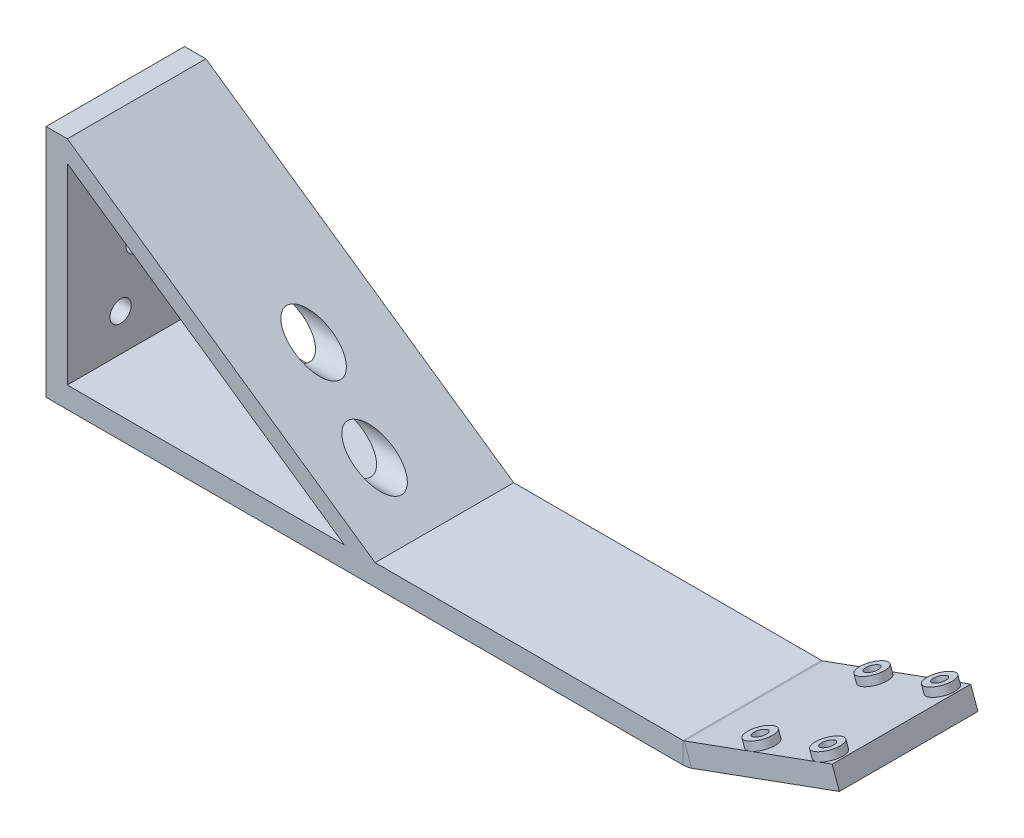
ISO-10303-21;
HEADER;
FILE_DESCRIPTION(('STEP AP214'),'2;1');
FILE_NAME('part.step','',(''),(''),'','','');
FILE_SCHEMA(('AUTOMOTIVE_DESIGN { 1 0 10303 214 1 1 1 1 }'));
ENDSEC;
DATA;
#1=APPLICATION_CONTEXT('core data for automotive mechanical design processes');
#2=APPLICATION_PROTOCOL_DEFINITION('international standard','automotive_design',2000,#1);
#3=PRODUCT_CONTEXT('',#1,'mechanical');
#4=PRODUCT('Part','Part','',(#3));
#5=PRODUCT_RELATED_PRODUCT_CATEGORY('part','',(#4));
#6=PRODUCT_DEFINITION_FORMATION('','',#4);
#7=PRODUCT_DEFINITION_CONTEXT('part definition',#1,'design');
#8=PRODUCT_DEFINITION('design','',#6,#7);
#9=PRODUCT_DEFINITION_SHAPE('','',#8);
#10=(LENGTH_UNIT() NAMED_UNIT(*) SI_UNIT(.MILLI.,.METRE.));
#11=(NAMED_UNIT(*) PLANE_ANGLE_UNIT() SI_UNIT($,.RADIAN.));
#12=(NAMED_UNIT(*) SI_UNIT($,.STERADIAN.) SOLID_ANGLE_UNIT());
#13=UNCERTAINTY_MEASURE_WITH_UNIT(LENGTH_MEASURE(1.E-05),#10,'distance_accuracy_value','');
#14=(GEOMETRIC_REPRESENTATION_CONTEXT(3) GLOBAL_UNCERTAINTY_ASSIGNED_CONTEXT((#13)) GLOBAL_UNIT_ASSIGNED_CONTEXT((#10,
#11,#12)) REPRESENTATION_CONTEXT('',''));
#15=CARTESIAN_POINT('',(0.,0.,0.));
#16=DIRECTION('',(0.,0.,1.));
#17=DIRECTION('',(1.,0.,0.));
#18=AXIS2_PLACEMENT_3D('',#15,#16,#17);
#19=CARTESIAN_POINT('',(0.,0.,0.));
#20=DIRECTION('',(0.,1.,0.));
#21=DIRECTION('',(0.,0.,1.));
#22=AXIS2_PLACEMENT_3D('',#19,#20,#21);
#23=PLANE('',#22);
#24=DIRECTION('',(1.,0.,0.));
#25=VECTOR('',#24,1.);
#26=CARTESIAN_POINT('',(-75.,0.,13.));
#27=LINE('',#26,#25);
#28=CARTESIAN_POINT('',(-71.,0.,13.));
#29=VERTEX_POINT('',#28);
#30=CARTESIAN_POINT('',(-19.0149320613954,0.,13.));
#31=VERTEX_POINT('',#30);
#32=EDGE_CURVE('E69',#29,#31,#27,.T.);
#33=ORIENTED_EDGE('',*,*,#32,.T.);
#34=DIRECTION('',(0.,0.,-1.));
#35=VECTOR('',#34,1.);
#36=CARTESIAN_POINT('',(-19.0149320613954,0.,0.));
#37=LINE('',#36,#35);
#38=CARTESIAN_POINT('',(-19.0149320613954,0.,-13.));
#39=VERTEX_POINT('',#38);
#40=EDGE_CURVE('E208',#31,#39,#37,.T.);
#41=ORIENTED_EDGE('',*,*,#40,.T.);
#42=DIRECTION('',(-1.,0.,0.));
#43=VECTOR('',#42,1.);
#44=CARTESIAN_POINT('',(-75.,0.,-13.));
#45=LINE('',#44,#43);
#46=CARTESIAN_POINT('',(-71.,0.,-13.));
#47=VERTEX_POINT('',#46);
#48=EDGE_CURVE('E248',#39,#47,#45,.T.);
#49=ORIENTED_EDGE('',*,*,#48,.T.);
#50=DIRECTION('',(0.,0.,-1.));
#51=VECTOR('',#50,1.);
#52=CARTESIAN_POINT('',(-71.,0.,13.));
#53=LINE('',#52,#51);
#54=EDGE_CURVE('E181',#29,#47,#53,.T.);
#55=ORIENTED_EDGE('',*,*,#54,.F.);
#56=EDGE_LOOP('',(#33,#41,#49,#55));
#57=FACE_BOUND('',#56,.T.);
#58=ADVANCED_FACE('F44',(#57),#23,.T.);
#59=CARTESIAN_POINT('',(-71.,40.,13.));
#60=DIRECTION('',(-1.,0.,0.));
#61=DIRECTION('',(0.,0.,1.));
#62=AXIS2_PLACEMENT_3D('',#59,#60,#61);
#63=PLANE('',#62);
#64=CARTESIAN_POINT('',(-71.,7.,3.00000000000004));
#65=DIRECTION('',(1.,0.,0.));
#66=DIRECTION('',(0.,0.,-1.));
#67=AXIS2_PLACEMENT_3D('',#64,#65,#66);
#68=CIRCLE('',#67,2.);
#69=CARTESIAN_POINT('',(-71.,7.,1.00000000000004));
#70=VERTEX_POINT('',#69);
#71=EDGE_CURVE('E190',#70,#70,#68,.T.);
#72=ORIENTED_EDGE('',*,*,#71,.F.);
#73=EDGE_LOOP('',(#72));
#74=FACE_BOUND('',#73,.T.);
#75=CARTESIAN_POINT('',(-71.,17.,0.));
#76=DIRECTION('',(1.,0.,0.));
#77=DIRECTION('',(0.,0.,-1.));
#78=AXIS2_PLACEMENT_3D('',#75,#76,#77);
#79=CIRCLE('',#78,2.);
#80=CARTESIAN_POINT('',(-71.,17.,-1.99999999999996));
#81=VERTEX_POINT('',#80);
#82=EDGE_CURVE('E196',#81,#81,#79,.T.);
#83=ORIENTED_EDGE('',*,*,#82,.F.);
#84=EDGE_LOOP('',(#83));
#85=FACE_BOUND('',#84,.T.);
#86=DIRECTION('',(0.,0.,-1.));
#87=VECTOR('',#86,1.);
#88=CARTESIAN_POINT('',(-71.,36.,-13.));
#89=LINE('',#88,#87);
#90=CARTESIAN_POINT('',(-71.,36.,13.));
#91=VERTEX_POINT('',#90);
#92=CARTESIAN_POINT('',(-71.,36.,-13.));
#93=VERTEX_POINT('',#92);
#94=EDGE_CURVE('E194',#91,#93,#89,.T.);
#95=ORIENTED_EDGE('',*,*,#94,.F.);
#96=DIRECTION('',(0.,-1.,0.));
#97=VECTOR('',#96,1.);
#98=CARTESIAN_POINT('',(-71.,40.,13.));
#99=LINE('',#98,#97);
#100=EDGE_CURVE('E239',#91,#29,#99,.T.);
#101=ORIENTED_EDGE('',*,*,#100,.T.);
#102=ORIENTED_EDGE('',*,*,#54,.T.);
#103=DIRECTION('',(0.,-1.,0.));
#104=VECTOR('',#103,1.);
#105=CARTESIAN_POINT('',(-71.,40.,-13.));
#106=LINE('',#105,#104);
#107=EDGE_CURVE('E235',#93,#47,#106,.T.);
#108=ORIENTED_EDGE('',*,*,#107,.F.);
#109=EDGE_LOOP('',(#95,#101,#102,#108));
#110=FACE_BOUND('',#109,.T.);
#111=ADVANCED_FACE('F419',(#74,#85,#110),#63,.F.);
#112=DIRECTION('',(0.,0.,1.));
#113=VECTOR('',#112,1.);
#114=CARTESIAN_POINT('',(-13.2388134015504,0.,-13.));
#115=LINE('',#114,#113);
#116=CARTESIAN_POINT('',(-13.2388134015504,0.,-13.));
#117=VERTEX_POINT('',#116);
#118=CARTESIAN_POINT('',(-13.2388134015504,0.,13.));
#119=VERTEX_POINT('',#118);
#120=EDGE_CURVE('E61',#117,#119,#115,.T.);
#121=ORIENTED_EDGE('',*,*,#120,.T.);
#122=CARTESIAN_POINT('',(44.5223731968992,0.,13.));
#123=VERTEX_POINT('',#122);
#124=EDGE_CURVE('E174',#119,#123,#27,.T.);
#125=ORIENTED_EDGE('',*,*,#124,.T.);
#126=DIRECTION('',(0.,0.,-1.));
#127=VECTOR('',#126,1.);
#128=CARTESIAN_POINT('',(44.5223731968992,0.,0.));
#129=LINE('',#128,#127);
#130=CARTESIAN_POINT('',(44.5223731968992,0.,-13.));
#131=VERTEX_POINT('',#130);
#132=EDGE_CURVE('E254',#123,#131,#129,.T.);
#133=ORIENTED_EDGE('',*,*,#132,.T.);
#134=EDGE_CURVE('E244',#131,#117,#45,.T.);
#135=ORIENTED_EDGE('',*,*,#134,.T.);
#136=EDGE_LOOP('',(#121,#125,#133,#135));
#137=FACE_BOUND('',#136,.T.);
#138=ADVANCED_FACE('F421',(#137),#23,.T.);
#139=CARTESIAN_POINT('',(3.40739549004638,-19.2686125049224,0.));
#140=DIRECTION('',(-0.342020143325669,0.939692620785908,0.));
#141=DIRECTION('',(0.,0.,1.));
#142=AXIS2_PLACEMENT_3D('',#139,#140,#141);
#143=PLANE('',#142);
#144=CARTESIAN_POINT('',(71.0652641866318,5.35683781452583,-10.5));
#145=DIRECTION('',(-0.342020143325669,0.939692620785908,0.));
#146=DIRECTION('',(-0.939692620785908,-0.342020143325669,0.));
#147=AXIS2_PLACEMENT_3D('',#144,#145,#146);
#148=CIRCLE('',#147,1.25);
#149=CARTESIAN_POINT('',(69.8906484106494,4.92931263536875,-10.5));
#150=VERTEX_POINT('',#149);
#151=EDGE_CURVE('E375',#150,#150,#148,.T.);
#152=ORIENTED_EDGE('',*,*,#151,.T.);
#153=EDGE_LOOP('',(#152));
#154=FACE_BOUND('',#153,.T.);
#155=CARTESIAN_POINT('',(58.379413806022,0.739565879629296,10.5));
#156=DIRECTION('',(-0.342020143325669,0.939692620785908,0.));
#157=DIRECTION('',(-0.939692620785908,-0.342020143325669,0.));
#158=AXIS2_PLACEMENT_3D('',#155,#156,#157);
#159=CIRCLE('',#158,1.25);
#160=CARTESIAN_POINT('',(57.2047980300396,0.312040700472209,10.5));
#161=VERTEX_POINT('',#160);
#162=EDGE_CURVE('E381',#161,#161,#159,.F.);
#163=ORIENTED_EDGE('',*,*,#162,.F.);
#164=EDGE_LOOP('',(#163));
#165=FACE_BOUND('',#164,.T.);
#166=CARTESIAN_POINT('',(58.379413806022,0.739565879629296,-10.5));
#167=DIRECTION('',(-0.342020143325669,0.939692620785908,0.));
#168=DIRECTION('',(-0.939692620785908,-0.342020143325669,0.));
#169=AXIS2_PLACEMENT_3D('',#166,#167,#168);
#170=CIRCLE('',#169,1.25);
#171=CARTESIAN_POINT('',(57.2047980300396,0.312040700472209,-10.5));
#172=VERTEX_POINT('',#171);
#173=EDGE_CURVE('E370',#172,#172,#170,.T.);
#174=ORIENTED_EDGE('',*,*,#173,.T.);
#175=EDGE_LOOP('',(#174));
#176=FACE_BOUND('',#175,.T.);
#177=CARTESIAN_POINT('',(71.0652641866318,5.35683781452583,10.5));
#178=DIRECTION('',(-0.342020143325669,0.939692620785908,0.));
#179=DIRECTION('',(-0.939692620785908,-0.342020143325669,0.));
#180=AXIS2_PLACEMENT_3D('',#177,#178,#179);
#181=CIRCLE('',#180,1.25);
#182=CARTESIAN_POINT('',(69.8906484106494,4.92931263536875,10.5));
#183=VERTEX_POINT('',#182);
#184=EDGE_CURVE('E366',#183,#183,#181,.F.);
#185=ORIENTED_EDGE('',*,*,#184,.F.);
#186=EDGE_LOOP('',(#185));
#187=FACE_BOUND('',#186,.T.);
#188=DIRECTION('',(0.939692620785908,0.342020143325669,0.));
#189=VECTOR('',#188,1.);
#190=CARTESIAN_POINT('',(-67.0695510688967,-44.9201232543476,13.));
#191=LINE('',#190,#189);
#192=CARTESIAN_POINT('',(46.1423858077756,-3.71434806761453,13.));
#193=VERTEX_POINT('',#192);
#194=CARTESIAN_POINT('',(73.8843420489895,6.38289824450285,13.));
#195=VERTEX_POINT('',#194);
#196=EDGE_CURVE('E240',#193,#195,#191,.T.);
#197=ORIENTED_EDGE('',*,*,#196,.F.);
#198=DIRECTION('',(0.,0.,-1.));
#199=VECTOR('',#198,1.);
#200=CARTESIAN_POINT('',(46.1423858077756,-3.71434806761453,0.));
#201=LINE('',#200,#199);
#202=CARTESIAN_POINT('',(46.1423858077756,-3.71434806761454,-13.));
#203=VERTEX_POINT('',#202);
#204=EDGE_CURVE('E295',#193,#203,#201,.T.);
#205=ORIENTED_EDGE('',*,*,#204,.T.);
#206=DIRECTION('',(-0.939692620785908,-0.342020143325669,0.));
#207=VECTOR('',#206,1.);
#208=CARTESIAN_POINT('',(-67.0695510688967,-44.9201232543476,-13.));
#209=LINE('',#208,#207);
#210=CARTESIAN_POINT('',(73.8843420489895,6.38289824450285,-13.));
#211=VERTEX_POINT('',#210);
#212=EDGE_CURVE('E287',#211,#203,#209,.T.);
#213=ORIENTED_EDGE('',*,*,#212,.F.);
#214=DIRECTION('',(0.,0.,-1.));
#215=VECTOR('',#214,1.);
#216=CARTESIAN_POINT('',(73.8843420489895,6.38289824450285,-13.));
#217=LINE('',#216,#215);
#218=EDGE_CURVE('E284',#195,#211,#217,.T.);
#219=ORIENTED_EDGE('',*,*,#218,.F.);
#220=EDGE_LOOP('',(#197,#205,#213,#219));
#221=FACE_BOUND('',#220,.T.);
#222=ADVANCED_FACE('F389',(#154,#165,#176,#187,#221),#143,.F.);
#223=CARTESIAN_POINT('',(-67.0695510688967,-44.9201232543476,-13.));
#224=DIRECTION('',(0.,0.,-1.));
#225=DIRECTION('',(-0.939692620785908,-0.342020143325669,0.));
#226=AXIS2_PLACEMENT_3D('',#223,#224,#225);
#227=PLANE('',#226);
#228=DIRECTION('',(0.342020143325669,-0.939692620785908,0.));
#229=VECTOR('',#228,1.);
#230=CARTESIAN_POINT('',(46.1423858077756,-3.71434806761453,-13.));
#231=LINE('',#230,#229);
#232=CARTESIAN_POINT('',(44.7743052344729,0.0444224155290995,-13.));
#233=VERTEX_POINT('',#232);
#234=EDGE_CURVE('E13',#233,#203,#231,.T.);
#235=ORIENTED_EDGE('',*,*,#234,.F.);
#236=DIRECTION('',(-0.939692620785908,-0.342020143325669,0.));
#237=VECTOR('',#236,1.);
#238=CARTESIAN_POINT('',(-68.4376316421994,-41.1613527712039,-13.));
#239=LINE('',#238,#237);
#240=CARTESIAN_POINT('',(57.0113332327193,4.49833636277293,-13.));
#241=VERTEX_POINT('',#240);
#242=EDGE_CURVE('E291',#241,#233,#239,.T.);
#243=ORIENTED_EDGE('',*,*,#242,.F.);
#244=CARTESIAN_POINT('',(69.6971836133291,9.11560829766946,-13.));
#245=VERTEX_POINT('',#244);
#246=EDGE_CURVE('E309',#245,#241,#239,.T.);
#247=ORIENTED_EDGE('',*,*,#246,.F.);
#248=CARTESIAN_POINT('',(72.5162614756868,10.1416687276465,-13.));
#249=VERTEX_POINT('',#248);
#250=EDGE_CURVE('E307',#249,#245,#239,.T.);
#251=ORIENTED_EDGE('',*,*,#250,.F.);
#252=DIRECTION('',(-0.342020143325669,0.939692620785908,0.));
#253=VECTOR('',#252,1.);
#254=CARTESIAN_POINT('',(73.8843420489895,6.38289824450285,-13.));
#255=LINE('',#254,#253);
#256=EDGE_CURVE('E293',#211,#249,#255,.T.);
#257=ORIENTED_EDGE('',*,*,#256,.F.);
#258=ORIENTED_EDGE('',*,*,#212,.T.);
#259=EDGE_LOOP('',(#235,#243,#247,#251,#257,#258));
#260=FACE_BOUND('',#259,.T.);
#261=ADVANCED_FACE('F46',(#260),#227,.T.);
#262=CARTESIAN_POINT('',(73.8843420489895,6.38289824450285,-13.));
#263=DIRECTION('',(0.939692620785908,0.342020143325669,0.));
#264=DIRECTION('',(0.,0.,-1.));
#265=AXIS2_PLACEMENT_3D('',#262,#263,#264);
#266=PLANE('',#265);
#267=DIRECTION('',(0.,0.,-1.));
#268=VECTOR('',#267,1.);
#269=CARTESIAN_POINT('',(72.5162614756868,10.1416687276465,-13.));
#270=LINE('',#269,#268);
#271=CARTESIAN_POINT('',(72.5162614756868,10.1416687276465,13.));
#272=VERTEX_POINT('',#271);
#273=EDGE_CURVE('E288',#272,#249,#270,.T.);
#274=ORIENTED_EDGE('',*,*,#273,.F.);
#275=DIRECTION('',(-0.342020143325669,0.939692620785908,0.));
#276=VECTOR('',#275,1.);
#277=CARTESIAN_POINT('',(73.8843420489895,6.38289824450285,13.));
#278=LINE('',#277,#276);
#279=EDGE_CURVE('E296',#195,#272,#278,.T.);
#280=ORIENTED_EDGE('',*,*,#279,.F.);
#281=ORIENTED_EDGE('',*,*,#218,.T.);
#282=ORIENTED_EDGE('',*,*,#256,.T.);
#283=EDGE_LOOP('',(#274,#280,#281,#282));
#284=FACE_BOUND('',#283,.T.);
#285=ADVANCED_FACE('F438',(#284),#266,.T.);
#286=CARTESIAN_POINT('',(-67.0695510688967,-44.9201232543476,13.));
#287=DIRECTION('',(0.,0.,1.));
#288=DIRECTION('',(0.939692620785908,0.342020143325669,0.));
#289=AXIS2_PLACEMENT_3D('',#286,#287,#288);
#290=PLANE('',#289);
#291=DIRECTION('',(-0.342020143325669,0.939692620785908,0.));
#292=VECTOR('',#291,1.);
#293=CARTESIAN_POINT('',(46.1423858077756,-3.71434806761453,13.));
#294=LINE('',#293,#292);
#295=CARTESIAN_POINT('',(44.7743052344729,0.0444224155290995,13.));
#296=VERTEX_POINT('',#295);
#297=EDGE_CURVE('E301',#193,#296,#294,.T.);
#298=ORIENTED_EDGE('',*,*,#297,.F.);
#299=ORIENTED_EDGE('',*,*,#196,.T.);
#300=ORIENTED_EDGE('',*,*,#279,.T.);
#301=DIRECTION('',(0.939692620785908,0.342020143325669,0.));
#302=VECTOR('',#301,1.);
#303=CARTESIAN_POINT('',(-68.4376316421994,-41.1613527712039,13.));
#304=LINE('',#303,#302);
#305=CARTESIAN_POINT('',(69.6971836133291,9.11560829766946,13.));
#306=VERTEX_POINT('',#305);
#307=EDGE_CURVE('E312',#306,#272,#304,.T.);
#308=ORIENTED_EDGE('',*,*,#307,.F.);
#309=CARTESIAN_POINT('',(57.0113332327193,4.49833636277293,13.));
#310=VERTEX_POINT('',#309);
#311=EDGE_CURVE('E311',#310,#306,#304,.T.);
#312=ORIENTED_EDGE('',*,*,#311,.F.);
#313=EDGE_CURVE('E292',#296,#310,#304,.T.);
#314=ORIENTED_EDGE('',*,*,#313,.F.);
#315=EDGE_LOOP('',(#298,#299,#300,#308,#312,#314));
#316=FACE_BOUND('',#315,.T.);
#317=ADVANCED_FACE('F443',(#316),#290,.T.);
#318=CARTESIAN_POINT('',(2.0393149167437,-15.5098420217787,0.));
#319=DIRECTION('',(-0.342020143325669,0.939692620785908,0.));
#320=DIRECTION('',(0.,0.,1.));
#321=AXIS2_PLACEMENT_3D('',#318,#319,#320);
#322=PLANE('',#321);
#323=ORIENTED_EDGE('',*,*,#313,.T.);
#324=CARTESIAN_POINT('',(57.0113332327193,4.49833636277293,10.5));
#325=DIRECTION('',(-0.342020143325669,0.939692620785908,0.));
#326=DIRECTION('',(0.939692620785908,0.342020143325669,0.));
#327=AXIS2_PLACEMENT_3D('',#324,#325,#326);
#328=CIRCLE('',#327,2.5);
#329=EDGE_CURVE('E359',#310,#310,#328,.T.);
#330=ORIENTED_EDGE('',*,*,#329,.F.);
#331=ORIENTED_EDGE('',*,*,#311,.T.);
#332=CARTESIAN_POINT('',(69.6971836133291,9.11560829766946,10.5));
#333=DIRECTION('',(-0.342020143325669,0.939692620785908,0.));
#334=DIRECTION('',(0.939692620785908,0.342020143325669,0.));
#335=AXIS2_PLACEMENT_3D('',#332,#333,#334);
#336=CIRCLE('',#335,2.5);
#337=EDGE_CURVE('E342',#306,#306,#336,.T.);
#338=ORIENTED_EDGE('',*,*,#337,.F.);
#339=ORIENTED_EDGE('',*,*,#307,.T.);
#340=ORIENTED_EDGE('',*,*,#273,.T.);
#341=ORIENTED_EDGE('',*,*,#250,.T.);
#342=CARTESIAN_POINT('',(69.6971836133291,9.11560829766946,-10.5));
#343=DIRECTION('',(-0.342020143325669,0.939692620785908,0.));
#344=DIRECTION('',(-0.939692620785908,-0.342020143325669,0.));
#345=AXIS2_PLACEMENT_3D('',#342,#343,#344);
#346=CIRCLE('',#345,2.5);
#347=EDGE_CURVE('E334',#245,#245,#346,.T.);
#348=ORIENTED_EDGE('',*,*,#347,.F.);
#349=ORIENTED_EDGE('',*,*,#246,.T.);
#350=CARTESIAN_POINT('',(57.0113332327193,4.49833636277293,-10.5));
#351=DIRECTION('',(-0.342020143325669,0.939692620785908,0.));
#352=DIRECTION('',(-0.939692620785908,-0.342020143325669,0.));
#353=AXIS2_PLACEMENT_3D('',#350,#351,#352);
#354=CIRCLE('',#353,2.5);
#355=EDGE_CURVE('E351',#241,#241,#354,.T.);
#356=ORIENTED_EDGE('',*,*,#355,.F.);
#357=ORIENTED_EDGE('',*,*,#242,.T.);
#358=DIRECTION('',(0.,0.,-1.));
#359=VECTOR('',#358,1.);
#360=CARTESIAN_POINT('',(44.7743052344729,0.044422415529103,0.));
#361=LINE('',#360,#359);
#362=EDGE_CURVE('E53',#296,#233,#361,.T.);
#363=ORIENTED_EDGE('',*,*,#362,.F.);
#364=EDGE_LOOP('',(#323,#330,#331,#338,#339,#340,#341,#348,#349,#356,#357,#363));
#365=FACE_BOUND('',#364,.T.);
#366=ADVANCED_FACE('F445',(#365),#322,.T.);
#367=CARTESIAN_POINT('',(-75.,-4.,-13.));
#368=DIRECTION('',(-1.,0.,0.));
#369=DIRECTION('',(0.,0.,1.));
#370=AXIS2_PLACEMENT_3D('',#367,#368,#369);
#371=PLANE('',#370);
#372=CARTESIAN_POINT('',(-75.,7.,3.00000000000004));
#373=DIRECTION('',(-1.,0.,0.));
#374=DIRECTION('',(0.,0.,1.));
#375=AXIS2_PLACEMENT_3D('',#372,#373,#374);
#376=CIRCLE('',#375,2.);
#377=CARTESIAN_POINT('',(-75.,7.,5.00000000000004));
#378=VERTEX_POINT('',#377);
#379=EDGE_CURVE('E48',#378,#378,#376,.T.);
#380=ORIENTED_EDGE('',*,*,#379,.F.);
#381=EDGE_LOOP('',(#380));
#382=FACE_BOUND('',#381,.T.);
#383=CARTESIAN_POINT('',(-75.,17.,0.));
#384=DIRECTION('',(-1.,0.,0.));
#385=DIRECTION('',(0.,0.,1.));
#386=AXIS2_PLACEMENT_3D('',#383,#384,#385);
#387=CIRCLE('',#386,2.);
#388=CARTESIAN_POINT('',(-75.,17.,2.00000000000004));
#389=VERTEX_POINT('',#388);
#390=EDGE_CURVE('E188',#389,#389,#387,.T.);
#391=ORIENTED_EDGE('',*,*,#390,.F.);
#392=EDGE_LOOP('',(#391));
#393=FACE_BOUND('',#392,.T.);
#394=DIRECTION('',(0.,1.,0.));
#395=VECTOR('',#394,1.);
#396=CARTESIAN_POINT('',(-75.,-4.,13.));
#397=LINE('',#396,#395);
#398=CARTESIAN_POINT('',(-75.,-4.,13.));
#399=VERTEX_POINT('',#398);
#400=CARTESIAN_POINT('',(-75.,40.,13.));
#401=VERTEX_POINT('',#400);
#402=EDGE_CURVE('E274',#399,#401,#397,.T.);
#403=ORIENTED_EDGE('',*,*,#402,.T.);
#404=DIRECTION('',(0.,0.,1.));
#405=VECTOR('',#404,1.);
#406=CARTESIAN_POINT('',(-75.,40.,13.));
#407=LINE('',#406,#405);
#408=CARTESIAN_POINT('',(-75.,40.,-13.));
#409=VERTEX_POINT('',#408);
#410=EDGE_CURVE('E179',#409,#401,#407,.T.);
#411=ORIENTED_EDGE('',*,*,#410,.F.);
#412=DIRECTION('',(0.,1.,0.));
#413=VECTOR('',#412,1.);
#414=CARTESIAN_POINT('',(-75.,-4.,-13.));
#415=LINE('',#414,#413);
#416=CARTESIAN_POINT('',(-75.,-4.,-13.));
#417=VERTEX_POINT('',#416);
#418=EDGE_CURVE('E272',#417,#409,#415,.T.);
#419=ORIENTED_EDGE('',*,*,#418,.F.);
#420=DIRECTION('',(0.,0.,1.));
#421=VECTOR('',#420,1.);
#422=CARTESIAN_POINT('',(-75.,-4.,-13.));
#423=LINE('',#422,#421);
#424=EDGE_CURVE('E275',#417,#399,#423,.T.);
#425=ORIENTED_EDGE('',*,*,#424,.T.);
#426=EDGE_LOOP('',(#403,#411,#419,#425));
#427=FACE_BOUND('',#426,.T.);
#428=ADVANCED_FACE('F270',(#382,#393,#427),#371,.T.);
#429=CARTESIAN_POINT('',(0.,-4.,0.));
#430=DIRECTION('',(0.,1.,0.));
#431=DIRECTION('',(0.,0.,1.));
#432=AXIS2_PLACEMENT_3D('',#429,#430,#431);
#433=PLANE('',#432);
#434=DIRECTION('',(0.,0.,-1.));
#435=VECTOR('',#434,1.);
#436=CARTESIAN_POINT('',(44.5223731968992,-4.,0.));
#437=LINE('',#436,#435);
#438=CARTESIAN_POINT('',(44.5223731968992,-4.,13.));
#439=VERTEX_POINT('',#438);
#440=CARTESIAN_POINT('',(44.5223731968992,-4.,-13.));
#441=VERTEX_POINT('',#440);
#442=EDGE_CURVE('E278',#439,#441,#437,.T.);
#443=ORIENTED_EDGE('',*,*,#442,.F.);
#444=DIRECTION('',(1.,0.,0.));
#445=VECTOR('',#444,1.);
#446=CARTESIAN_POINT('',(-75.,-4.,13.));
#447=LINE('',#446,#445);
#448=EDGE_CURVE('E264',#399,#439,#447,.T.);
#449=ORIENTED_EDGE('',*,*,#448,.F.);
#450=ORIENTED_EDGE('',*,*,#424,.F.);
#451=DIRECTION('',(-1.,0.,0.));
#452=VECTOR('',#451,1.);
#453=CARTESIAN_POINT('',(-75.,-4.,-13.));
#454=LINE('',#453,#452);
#455=EDGE_CURVE('E318',#441,#417,#454,.T.);
#456=ORIENTED_EDGE('',*,*,#455,.F.);
#457=EDGE_LOOP('',(#443,#449,#450,#456));
#458=FACE_BOUND('',#457,.T.);
#459=ADVANCED_FACE('F451',(#458),#433,.F.);
#460=CARTESIAN_POINT('',(-75.,-4.,13.));
#461=DIRECTION('',(0.,0.,1.));
#462=DIRECTION('',(1.,0.,0.));
#463=AXIS2_PLACEMENT_3D('',#460,#461,#462);
#464=PLANE('',#463);
#465=ORIENTED_EDGE('',*,*,#124,.F.);
#466=DIRECTION('',(-0.822115674060011,0.569320488358581,0.));
#467=VECTOR('',#466,1.);
#468=CARTESIAN_POINT('',(-71.,40.,13.));
#469=LINE('',#468,#467);
#470=CARTESIAN_POINT('',(-71.,40.,13.));
#471=VERTEX_POINT('',#470);
#472=EDGE_CURVE('E158',#119,#471,#469,.T.);
#473=ORIENTED_EDGE('',*,*,#472,.T.);
#474=DIRECTION('',(1.,0.,0.));
#475=VECTOR('',#474,1.);
#476=CARTESIAN_POINT('',(-75.,40.,13.));
#477=LINE('',#476,#475);
#478=EDGE_CURVE('E166',#401,#471,#477,.T.);
#479=ORIENTED_EDGE('',*,*,#478,.F.);
#480=ORIENTED_EDGE('',*,*,#402,.F.);
#481=ORIENTED_EDGE('',*,*,#448,.T.);
#482=DIRECTION('',(0.,1.,0.));
#483=VECTOR('',#482,1.);
#484=CARTESIAN_POINT('',(44.5223731968992,-4.,13.));
#485=LINE('',#484,#483);
#486=EDGE_CURVE('E260',#439,#123,#485,.T.);
#487=ORIENTED_EDGE('',*,*,#486,.T.);
#488=EDGE_LOOP('',(#465,#473,#479,#480,#481,#487));
#489=FACE_BOUND('',#488,.T.);
#490=DIRECTION('',(-0.822115674060011,0.569320488358581,0.));
#491=VECTOR('',#490,1.);
#492=CARTESIAN_POINT('',(-71.,36.,13.));
#493=LINE('',#492,#491);
#494=EDGE_CURVE('E175',#31,#91,#493,.T.);
#495=ORIENTED_EDGE('',*,*,#494,.F.);
#496=ORIENTED_EDGE('',*,*,#32,.F.);
#497=ORIENTED_EDGE('',*,*,#100,.F.);
#498=EDGE_LOOP('',(#495,#496,#497));
#499=FACE_BOUND('',#498,.T.);
#500=ADVANCED_FACE('F170',(#489,#499),#464,.T.);
#501=CARTESIAN_POINT('',(-75.,-4.,-13.));
#502=DIRECTION('',(0.,0.,-1.));
#503=DIRECTION('',(-1.,0.,0.));
#504=AXIS2_PLACEMENT_3D('',#501,#502,#503);
#505=PLANE('',#504);
#506=ORIENTED_EDGE('',*,*,#48,.F.);
#507=DIRECTION('',(0.822115674060011,-0.569320488358581,0.));
#508=VECTOR('',#507,1.);
#509=CARTESIAN_POINT('',(-71.,36.,-13.));
#510=LINE('',#509,#508);
#511=EDGE_CURVE('E209',#93,#39,#510,.T.);
#512=ORIENTED_EDGE('',*,*,#511,.F.);
#513=ORIENTED_EDGE('',*,*,#107,.T.);
#514=EDGE_LOOP('',(#506,#512,#513));
#515=FACE_BOUND('',#514,.T.);
#516=ORIENTED_EDGE('',*,*,#455,.T.);
#517=ORIENTED_EDGE('',*,*,#418,.T.);
#518=DIRECTION('',(-1.,0.,0.));
#519=VECTOR('',#518,1.);
#520=CARTESIAN_POINT('',(-75.,40.,-13.));
#521=LINE('',#520,#519);
#522=CARTESIAN_POINT('',(-71.,40.,-13.));
#523=VERTEX_POINT('',#522);
#524=EDGE_CURVE('E165',#523,#409,#521,.T.);
#525=ORIENTED_EDGE('',*,*,#524,.F.);
#526=DIRECTION('',(0.822115674060011,-0.569320488358581,0.));
#527=VECTOR('',#526,1.);
#528=CARTESIAN_POINT('',(-71.,40.,-13.));
#529=LINE('',#528,#527);
#530=EDGE_CURVE('E160',#523,#117,#529,.T.);
#531=ORIENTED_EDGE('',*,*,#530,.T.);
#532=ORIENTED_EDGE('',*,*,#134,.F.);
#533=DIRECTION('',(0.,-1.,0.));
#534=VECTOR('',#533,1.);
#535=CARTESIAN_POINT('',(44.5223731968992,-4.,-13.));
#536=LINE('',#535,#534);
#537=EDGE_CURVE('E247',#131,#441,#536,.T.);
#538=ORIENTED_EDGE('',*,*,#537,.T.);
#539=EDGE_LOOP('',(#516,#517,#525,#531,#532,#538));
#540=FACE_BOUND('',#539,.T.);
#541=ADVANCED_FACE('F465',(#515,#540),#505,.T.);
#542=CARTESIAN_POINT('',(44.5223731968992,0.7366,13.));
#543=DIRECTION('',(0.,0.,1.));
#544=DIRECTION('',(1.,0.,0.));
#545=AXIS2_PLACEMENT_3D('',#542,#543,#544);
#546=PLANE('',#545);
#547=ORIENTED_EDGE('',*,*,#297,.T.);
#548=CARTESIAN_POINT('',(44.5223731968992,0.7366,13.));
#549=DIRECTION('',(0.,0.,1.));
#550=DIRECTION('',(1.,0.,0.));
#551=AXIS2_PLACEMENT_3D('',#548,#549,#550);
#552=CIRCLE('',#551,0.7366);
#553=EDGE_CURVE('E321',#296,#123,#552,.F.);
#554=ORIENTED_EDGE('',*,*,#553,.T.);
#555=ORIENTED_EDGE('',*,*,#486,.F.);
#556=CARTESIAN_POINT('',(44.5223731968992,0.7366,13.));
#557=DIRECTION('',(0.,0.,-1.));
#558=DIRECTION('',(1.,0.,0.));
#559=AXIS2_PLACEMENT_3D('',#556,#557,#558);
#560=CIRCLE('',#559,4.7366);
#561=EDGE_CURVE('E329',#193,#439,#560,.T.);
#562=ORIENTED_EDGE('',*,*,#561,.F.);
#563=EDGE_LOOP('',(#547,#554,#555,#562));
#564=FACE_BOUND('',#563,.T.);
#565=ADVANCED_FACE('F462',(#564),#546,.T.);
#566=CARTESIAN_POINT('',(44.5223731968992,0.7366,-13.));
#567=DIRECTION('',(0.,0.,-1.));
#568=DIRECTION('',(-1.,0.,0.));
#569=AXIS2_PLACEMENT_3D('',#566,#567,#568);
#570=PLANE('',#569);
#571=ORIENTED_EDGE('',*,*,#537,.F.);
#572=CARTESIAN_POINT('',(44.5223731968992,0.7366,-13.));
#573=DIRECTION('',(0.,0.,1.));
#574=DIRECTION('',(1.,0.,0.));
#575=AXIS2_PLACEMENT_3D('',#572,#573,#574);
#576=CIRCLE('',#575,0.7366);
#577=EDGE_CURVE('E325',#131,#233,#576,.T.);
#578=ORIENTED_EDGE('',*,*,#577,.T.);
#579=ORIENTED_EDGE('',*,*,#234,.T.);
#580=CARTESIAN_POINT('',(44.5223731968992,0.7366,-13.));
#581=DIRECTION('',(0.,0.,1.));
#582=DIRECTION('',(-1.,0.,0.));
#583=AXIS2_PLACEMENT_3D('',#580,#581,#582);
#584=CIRCLE('',#583,4.7366);
#585=EDGE_CURVE('E283',#441,#203,#584,.T.);
#586=ORIENTED_EDGE('',*,*,#585,.F.);
#587=EDGE_LOOP('',(#571,#578,#579,#586));
#588=FACE_BOUND('',#587,.T.);
#589=ADVANCED_FACE('F473',(#588),#570,.T.);
#590=CARTESIAN_POINT('',(44.5223731968992,0.7366,-26.3232313641802));
#591=DIRECTION('',(0.,0.,1.));
#592=DIRECTION('',(1.,0.,0.));
#593=AXIS2_PLACEMENT_3D('',#590,#591,#592);
#594=CYLINDRICAL_SURFACE('',#593,4.7366);
#595=ORIENTED_EDGE('',*,*,#585,.T.);
#596=ORIENTED_EDGE('',*,*,#204,.F.);
#597=ORIENTED_EDGE('',*,*,#561,.T.);
#598=ORIENTED_EDGE('',*,*,#442,.T.);
#599=EDGE_LOOP('',(#595,#596,#597,#598));
#600=FACE_BOUND('',#599,.T.);
#601=ADVANCED_FACE('F486',(#600),#594,.T.);
#602=CARTESIAN_POINT('',(44.5223731968992,0.7366,-26.3232313641802));
#603=DIRECTION('',(0.,0.,1.));
#604=DIRECTION('',(1.,0.,0.));
#605=AXIS2_PLACEMENT_3D('',#602,#603,#604);
#606=CYLINDRICAL_SURFACE('',#605,0.7366);
#607=ORIENTED_EDGE('',*,*,#577,.F.);
#608=ORIENTED_EDGE('',*,*,#132,.F.);
#609=ORIENTED_EDGE('',*,*,#553,.F.);
#610=ORIENTED_EDGE('',*,*,#362,.T.);
#611=EDGE_LOOP('',(#607,#608,#609,#610));
#612=FACE_BOUND('',#611,.T.);
#613=ADVANCED_FACE('F504',(#612),#606,.F.);
#614=CARTESIAN_POINT('',(69.1841533983406,10.5251472288483,-10.5));
#615=DIRECTION('',(-0.342020143325669,0.939692620785908,0.));
#616=DIRECTION('',(-0.939692620785908,-0.342020143325669,0.));
#617=AXIS2_PLACEMENT_3D('',#614,#615,#616);
#618=PLANE('',#617);
#619=CARTESIAN_POINT('',(69.1841533983406,10.5251472288483,-10.5));
#620=DIRECTION('',(-0.342020143325669,0.939692620785908,0.));
#621=DIRECTION('',(-0.939692620785908,-0.342020143325669,0.));
#622=AXIS2_PLACEMENT_3D('',#619,#620,#621);
#623=CIRCLE('',#622,2.5);
#624=CARTESIAN_POINT('',(66.8349218463758,9.67009687053415,-10.5));
#625=VERTEX_POINT('',#624);
#626=EDGE_CURVE('E326',#625,#625,#623,.T.);
#627=ORIENTED_EDGE('',*,*,#626,.T.);
#628=EDGE_LOOP('',(#627));
#629=FACE_BOUND('',#628,.T.);
#630=CARTESIAN_POINT('',(69.1841533983406,10.5251472288483,-10.5));
#631=DIRECTION('',(-0.342020143325669,0.939692620785908,0.));
#632=DIRECTION('',(-0.939692620785908,-0.342020143325669,0.));
#633=AXIS2_PLACEMENT_3D('',#630,#631,#632);
#634=CIRCLE('',#633,1.25);
#635=CARTESIAN_POINT('',(68.0095376223582,10.0976220496912,-10.5));
#636=VERTEX_POINT('',#635);
#637=EDGE_CURVE('E336',#636,#636,#634,.T.);
#638=ORIENTED_EDGE('',*,*,#637,.F.);
#639=EDGE_LOOP('',(#638));
#640=FACE_BOUND('',#639,.T.);
#641=ADVANCED_FACE('F511',(#629,#640),#618,.T.);
#642=CARTESIAN_POINT('',(69.1841533983406,10.5251472288483,-10.5));
#643=DIRECTION('',(0.342020143325669,-0.939692620785908,0.));
#644=DIRECTION('',(0.939692620785908,0.342020143325669,0.));
#645=AXIS2_PLACEMENT_3D('',#642,#643,#644);
#646=CYLINDRICAL_SURFACE('',#645,2.5);
#647=ORIENTED_EDGE('',*,*,#626,.F.);
#648=EDGE_LOOP('',(#647));
#649=FACE_BOUND('',#648,.T.);
#650=ORIENTED_EDGE('',*,*,#347,.T.);
#651=EDGE_LOOP('',(#650));
#652=FACE_BOUND('',#651,.T.);
#653=ADVANCED_FACE('F508',(#649,#652),#646,.T.);
#654=CARTESIAN_POINT('',(69.1841533983406,10.5251472288483,-10.5));
#655=DIRECTION('',(0.342020143325669,-0.939692620785908,0.));
#656=DIRECTION('',(0.939692620785908,0.342020143325669,0.));
#657=AXIS2_PLACEMENT_3D('',#654,#655,#656);
#658=CYLINDRICAL_SURFACE('',#657,1.25);
#659=ORIENTED_EDGE('',*,*,#637,.T.);
#660=EDGE_LOOP('',(#659));
#661=FACE_BOUND('',#660,.T.);
#662=CARTESIAN_POINT('',(69.6971836133291,9.11560829766946,-10.5));
#663=DIRECTION('',(-0.342020143325669,0.939692620785908,0.));
#664=DIRECTION('',(-0.939692620785908,-0.342020143325669,0.));
#665=AXIS2_PLACEMENT_3D('',#662,#663,#664);
#666=CIRCLE('',#665,1.25);
#667=CARTESIAN_POINT('',(68.5225678373467,8.68808311851238,-10.5));
#668=VERTEX_POINT('',#667);
#669=EDGE_CURVE('E243',#668,#668,#666,.T.);
#670=ORIENTED_EDGE('',*,*,#669,.F.);
#671=EDGE_LOOP('',(#670));
#672=FACE_BOUND('',#671,.T.);
#673=ADVANCED_FACE('F510',(#661,#672),#658,.F.);
#674=CARTESIAN_POINT('',(69.1841533983406,10.5251472288483,10.5));
#675=DIRECTION('',(0.342020143325669,-0.939692620785908,0.));
#676=DIRECTION('',(0.939692620785908,0.342020143325669,0.));
#677=AXIS2_PLACEMENT_3D('',#674,#675,#676);
#678=PLANE('',#677);
#679=CARTESIAN_POINT('',(69.1841533983406,10.5251472288483,10.5));
#680=DIRECTION('',(-0.342020143325669,0.939692620785908,0.));
#681=DIRECTION('',(0.939692620785908,0.342020143325669,0.));
#682=AXIS2_PLACEMENT_3D('',#679,#680,#681);
#683=CIRCLE('',#682,2.5);
#684=CARTESIAN_POINT('',(71.5333849503053,11.3801975871625,10.5));
#685=VERTEX_POINT('',#684);
#686=EDGE_CURVE('E341',#685,#685,#683,.T.);
#687=ORIENTED_EDGE('',*,*,#686,.T.);
#688=EDGE_LOOP('',(#687));
#689=FACE_BOUND('',#688,.T.);
#690=CARTESIAN_POINT('',(69.1841533983406,10.5251472288483,10.5));
#691=DIRECTION('',(-0.342020143325669,0.939692620785908,0.));
#692=DIRECTION('',(0.939692620785908,0.342020143325669,0.));
#693=AXIS2_PLACEMENT_3D('',#690,#691,#692);
#694=CIRCLE('',#693,1.25);
#695=CARTESIAN_POINT('',(70.3587691743229,10.9526724080054,10.5));
#696=VERTEX_POINT('',#695);
#697=EDGE_CURVE('E345',#696,#696,#694,.T.);
#698=ORIENTED_EDGE('',*,*,#697,.F.);
#699=EDGE_LOOP('',(#698));
#700=FACE_BOUND('',#699,.T.);
#701=ADVANCED_FACE('F518',(#689,#700),#678,.F.);
#702=CARTESIAN_POINT('',(69.1841533983406,10.5251472288483,10.5));
#703=DIRECTION('',(0.342020143325669,-0.939692620785908,0.));
#704=DIRECTION('',(0.939692620785908,0.342020143325669,0.));
#705=AXIS2_PLACEMENT_3D('',#702,#703,#704);
#706=CYLINDRICAL_SURFACE('',#705,2.5);
#707=ORIENTED_EDGE('',*,*,#686,.F.);
#708=EDGE_LOOP('',(#707));
#709=FACE_BOUND('',#708,.T.);
#710=ORIENTED_EDGE('',*,*,#337,.T.);
#711=EDGE_LOOP('',(#710));
#712=FACE_BOUND('',#711,.T.);
#713=ADVANCED_FACE('F568',(#709,#712),#706,.T.);
#714=CARTESIAN_POINT('',(69.1841533983406,10.5251472288483,10.5));
#715=DIRECTION('',(0.342020143325669,-0.939692620785908,0.));
#716=DIRECTION('',(0.939692620785908,0.342020143325669,0.));
#717=AXIS2_PLACEMENT_3D('',#714,#715,#716);
#718=CYLINDRICAL_SURFACE('',#717,1.25);
#719=ORIENTED_EDGE('',*,*,#697,.T.);
#720=EDGE_LOOP('',(#719));
#721=FACE_BOUND('',#720,.T.);
#722=CARTESIAN_POINT('',(69.6971836133291,9.11560829766946,10.5));
#723=DIRECTION('',(-0.342020143325669,0.939692620785908,0.));
#724=DIRECTION('',(-0.939692620785908,-0.342020143325669,0.));
#725=AXIS2_PLACEMENT_3D('',#722,#723,#724);
#726=CIRCLE('',#725,1.25);
#727=CARTESIAN_POINT('',(68.5225678373467,8.68808311851238,10.5));
#728=VERTEX_POINT('',#727);
#729=EDGE_CURVE('E367',#728,#728,#726,.F.);
#730=ORIENTED_EDGE('',*,*,#729,.T.);
#731=EDGE_LOOP('',(#730));
#732=FACE_BOUND('',#731,.T.);
#733=ADVANCED_FACE('F578',(#721,#732),#718,.F.);
#734=CARTESIAN_POINT('',(56.4983030177308,5.90787529395179,-10.5));
#735=DIRECTION('',(-0.342020143325669,0.939692620785908,0.));
#736=DIRECTION('',(-0.939692620785908,-0.342020143325669,0.));
#737=AXIS2_PLACEMENT_3D('',#734,#735,#736);
#738=PLANE('',#737);
#739=CARTESIAN_POINT('',(56.4983030177308,5.90787529395179,-10.5));
#740=DIRECTION('',(-0.342020143325669,0.939692620785908,0.));
#741=DIRECTION('',(-0.939692620785908,-0.342020143325669,0.));
#742=AXIS2_PLACEMENT_3D('',#739,#740,#741);
#743=CIRCLE('',#742,2.5);
#744=CARTESIAN_POINT('',(54.149071465766,5.05282493563762,-10.5));
#745=VERTEX_POINT('',#744);
#746=EDGE_CURVE('E350',#745,#745,#743,.T.);
#747=ORIENTED_EDGE('',*,*,#746,.T.);
#748=EDGE_LOOP('',(#747));
#749=FACE_BOUND('',#748,.T.);
#750=CARTESIAN_POINT('',(56.4983030177308,5.90787529395179,-10.5));
#751=DIRECTION('',(-0.342020143325669,0.939692620785908,0.));
#752=DIRECTION('',(-0.939692620785908,-0.342020143325669,0.));
#753=AXIS2_PLACEMENT_3D('',#750,#751,#752);
#754=CIRCLE('',#753,1.25);
#755=CARTESIAN_POINT('',(55.3236872417484,5.4803501147947,-10.5));
#756=VERTEX_POINT('',#755);
#757=EDGE_CURVE('E353',#756,#756,#754,.T.);
#758=ORIENTED_EDGE('',*,*,#757,.F.);
#759=EDGE_LOOP('',(#758));
#760=FACE_BOUND('',#759,.T.);
#761=ADVANCED_FACE('F413',(#749,#760),#738,.T.);
#762=CARTESIAN_POINT('',(56.4983030177308,5.90787529395179,-10.5));
#763=DIRECTION('',(0.342020143325669,-0.939692620785908,0.));
#764=DIRECTION('',(0.939692620785908,0.342020143325669,0.));
#765=AXIS2_PLACEMENT_3D('',#762,#763,#764);
#766=CYLINDRICAL_SURFACE('',#765,2.5);
#767=ORIENTED_EDGE('',*,*,#746,.F.);
#768=EDGE_LOOP('',(#767));
#769=FACE_BOUND('',#768,.T.);
#770=ORIENTED_EDGE('',*,*,#355,.T.);
#771=EDGE_LOOP('',(#770));
#772=FACE_BOUND('',#771,.T.);
#773=ADVANCED_FACE('F403',(#769,#772),#766,.T.);
#774=CARTESIAN_POINT('',(56.4983030177308,5.90787529395179,-10.5));
#775=DIRECTION('',(0.342020143325669,-0.939692620785908,0.));
#776=DIRECTION('',(0.939692620785908,0.342020143325669,0.));
#777=AXIS2_PLACEMENT_3D('',#774,#775,#776);
#778=CYLINDRICAL_SURFACE('',#777,1.25);
#779=ORIENTED_EDGE('',*,*,#757,.T.);
#780=EDGE_LOOP('',(#779));
#781=FACE_BOUND('',#780,.T.);
#782=CARTESIAN_POINT('',(57.0113332327193,4.49833636277293,-10.5));
#783=DIRECTION('',(-0.342020143325669,0.939692620785908,0.));
#784=DIRECTION('',(-0.939692620785908,-0.342020143325669,0.));
#785=AXIS2_PLACEMENT_3D('',#782,#783,#784);
#786=CIRCLE('',#785,1.25);
#787=CARTESIAN_POINT('',(55.8367174567369,4.07081118361584,-10.5));
#788=VERTEX_POINT('',#787);
#789=EDGE_CURVE('E384',#788,#788,#786,.T.);
#790=ORIENTED_EDGE('',*,*,#789,.F.);
#791=EDGE_LOOP('',(#790));
#792=FACE_BOUND('',#791,.T.);
#793=ADVANCED_FACE('F400',(#781,#792),#778,.F.);
#794=CARTESIAN_POINT('',(56.4983030177308,5.90787529395179,10.5));
#795=DIRECTION('',(0.342020143325669,-0.939692620785908,0.));
#796=DIRECTION('',(0.939692620785908,0.342020143325669,0.));
#797=AXIS2_PLACEMENT_3D('',#794,#795,#796);
#798=PLANE('',#797);
#799=CARTESIAN_POINT('',(56.4983030177308,5.90787529395179,10.5));
#800=DIRECTION('',(-0.342020143325669,0.939692620785908,0.));
#801=DIRECTION('',(0.939692620785908,0.342020143325669,0.));
#802=AXIS2_PLACEMENT_3D('',#799,#800,#801);
#803=CIRCLE('',#802,2.5);
#804=CARTESIAN_POINT('',(58.8475345696956,6.76292565226596,10.5));
#805=VERTEX_POINT('',#804);
#806=EDGE_CURVE('E358',#805,#805,#803,.T.);
#807=ORIENTED_EDGE('',*,*,#806,.T.);
#808=EDGE_LOOP('',(#807));
#809=FACE_BOUND('',#808,.T.);
#810=CARTESIAN_POINT('',(56.4983030177308,5.90787529395179,10.5));
#811=DIRECTION('',(-0.342020143325669,0.939692620785908,0.));
#812=DIRECTION('',(0.939692620785908,0.342020143325669,0.));
#813=AXIS2_PLACEMENT_3D('',#810,#811,#812);
#814=CIRCLE('',#813,1.25);
#815=CARTESIAN_POINT('',(57.6729187937132,6.33540047310888,10.5));
#816=VERTEX_POINT('',#815);
#817=EDGE_CURVE('E361',#816,#816,#814,.T.);
#818=ORIENTED_EDGE('',*,*,#817,.F.);
#819=EDGE_LOOP('',(#818));
#820=FACE_BOUND('',#819,.T.);
#821=ADVANCED_FACE('F402',(#809,#820),#798,.F.);
#822=CARTESIAN_POINT('',(56.4983030177308,5.90787529395179,10.5));
#823=DIRECTION('',(0.342020143325669,-0.939692620785908,0.));
#824=DIRECTION('',(0.939692620785908,0.342020143325669,0.));
#825=AXIS2_PLACEMENT_3D('',#822,#823,#824);
#826=CYLINDRICAL_SURFACE('',#825,2.5);
#827=ORIENTED_EDGE('',*,*,#806,.F.);
#828=EDGE_LOOP('',(#827));
#829=FACE_BOUND('',#828,.T.);
#830=ORIENTED_EDGE('',*,*,#329,.T.);
#831=EDGE_LOOP('',(#830));
#832=FACE_BOUND('',#831,.T.);
#833=ADVANCED_FACE('F410',(#829,#832),#826,.T.);
#834=CARTESIAN_POINT('',(56.4983030177308,5.90787529395179,10.5));
#835=DIRECTION('',(0.342020143325669,-0.939692620785908,0.));
#836=DIRECTION('',(0.939692620785908,0.342020143325669,0.));
#837=AXIS2_PLACEMENT_3D('',#834,#835,#836);
#838=CYLINDRICAL_SURFACE('',#837,1.25);
#839=ORIENTED_EDGE('',*,*,#817,.T.);
#840=EDGE_LOOP('',(#839));
#841=FACE_BOUND('',#840,.T.);
#842=CARTESIAN_POINT('',(57.0113332327193,4.49833636277293,10.5));
#843=DIRECTION('',(-0.342020143325669,0.939692620785908,0.));
#844=DIRECTION('',(-0.939692620785908,-0.342020143325669,0.));
#845=AXIS2_PLACEMENT_3D('',#842,#843,#844);
#846=CIRCLE('',#845,1.25);
#847=CARTESIAN_POINT('',(55.8367174567369,4.07081118361584,10.5));
#848=VERTEX_POINT('',#847);
#849=EDGE_CURVE('E378',#848,#848,#846,.F.);
#850=ORIENTED_EDGE('',*,*,#849,.T.);
#851=EDGE_LOOP('',(#850));
#852=FACE_BOUND('',#851,.T.);
#853=ADVANCED_FACE('F621',(#841,#852),#838,.F.);
#854=CARTESIAN_POINT('',(69.6971836133291,9.11560829766946,10.5));
#855=DIRECTION('',(-0.342020143325669,0.939692620785908,0.));
#856=DIRECTION('',(-0.939692620785908,-0.342020143325669,0.));
#857=AXIS2_PLACEMENT_3D('',#854,#855,#856);
#858=CYLINDRICAL_SURFACE('',#857,1.25);
#859=ORIENTED_EDGE('',*,*,#184,.T.);
#860=EDGE_LOOP('',(#859));
#861=FACE_BOUND('',#860,.T.);
#862=ORIENTED_EDGE('',*,*,#729,.F.);
#863=EDGE_LOOP('',(#862));
#864=FACE_BOUND('',#863,.T.);
#865=ADVANCED_FACE('F396',(#861,#864),#858,.F.);
#866=CARTESIAN_POINT('',(57.0113332327193,4.49833636277293,-10.5));
#867=DIRECTION('',(-0.342020143325669,0.939692620785908,0.));
#868=DIRECTION('',(-0.939692620785908,-0.342020143325669,0.));
#869=AXIS2_PLACEMENT_3D('',#866,#867,#868);
#870=CYLINDRICAL_SURFACE('',#869,1.25);
#871=ORIENTED_EDGE('',*,*,#173,.F.);
#872=EDGE_LOOP('',(#871));
#873=FACE_BOUND('',#872,.T.);
#874=ORIENTED_EDGE('',*,*,#789,.T.);
#875=EDGE_LOOP('',(#874));
#876=FACE_BOUND('',#875,.T.);
#877=ADVANCED_FACE('F392',(#873,#876),#870,.F.);
#878=CARTESIAN_POINT('',(57.0113332327193,4.49833636277293,10.5));
#879=DIRECTION('',(-0.342020143325669,0.939692620785908,0.));
#880=DIRECTION('',(-0.939692620785908,-0.342020143325669,0.));
#881=AXIS2_PLACEMENT_3D('',#878,#879,#880);
#882=CYLINDRICAL_SURFACE('',#881,1.25);
#883=ORIENTED_EDGE('',*,*,#162,.T.);
#884=EDGE_LOOP('',(#883));
#885=FACE_BOUND('',#884,.T.);
#886=ORIENTED_EDGE('',*,*,#849,.F.);
#887=EDGE_LOOP('',(#886));
#888=FACE_BOUND('',#887,.T.);
#889=ADVANCED_FACE('F395',(#885,#888),#882,.F.);
#890=CARTESIAN_POINT('',(69.6971836133291,9.11560829766946,-10.5));
#891=DIRECTION('',(-0.342020143325669,0.939692620785908,0.));
#892=DIRECTION('',(-0.939692620785908,-0.342020143325669,0.));
#893=AXIS2_PLACEMENT_3D('',#890,#891,#892);
#894=CYLINDRICAL_SURFACE('',#893,1.25);
#895=ORIENTED_EDGE('',*,*,#151,.F.);
#896=EDGE_LOOP('',(#895));
#897=FACE_BOUND('',#896,.T.);
#898=ORIENTED_EDGE('',*,*,#669,.T.);
#899=EDGE_LOOP('',(#898));
#900=FACE_BOUND('',#899,.T.);
#901=ADVANCED_FACE('F663',(#897,#900),#894,.F.);
#902=CARTESIAN_POINT('',(0.,40.,0.));
#903=DIRECTION('',(0.,-1.,0.));
#904=DIRECTION('',(0.,0.,-1.));
#905=AXIS2_PLACEMENT_3D('',#902,#903,#904);
#906=PLANE('',#905);
#907=ORIENTED_EDGE('',*,*,#410,.T.);
#908=ORIENTED_EDGE('',*,*,#478,.T.);
#909=DIRECTION('',(0.,0.,-1.));
#910=VECTOR('',#909,1.);
#911=CARTESIAN_POINT('',(-71.,40.,13.));
#912=LINE('',#911,#910);
#913=EDGE_CURVE('E155',#471,#523,#912,.T.);
#914=ORIENTED_EDGE('',*,*,#913,.T.);
#915=ORIENTED_EDGE('',*,*,#524,.T.);
#916=EDGE_LOOP('',(#907,#908,#914,#915));
#917=FACE_BOUND('',#916,.T.);
#918=ADVANCED_FACE('F177',(#917),#906,.F.);
#919=CARTESIAN_POINT('',(-4.291041229281,-10.1963908286535,0.));
#920=DIRECTION('',(0.569320488358581,0.822115674060011,0.));
#921=DIRECTION('',(-0.822115674060011,0.569320488358581,0.));
#922=AXIS2_PLACEMENT_3D('',#919,#920,#921);
#923=PLANE('',#922);
#924=CARTESIAN_POINT('',(-29.123139716124,7.,3.00000000000001));
#925=DIRECTION('',(0.569320488358581,0.822115674060011,0.));
#926=DIRECTION('',(-0.822115674060011,0.569320488358581,0.));
#927=AXIS2_PLACEMENT_3D('',#924,#925,#926);
#928=ELLIPSE('',#927,6.14767968405795,3.5);
#929=CARTESIAN_POINT('',(-34.1772435434884,10.5,3.00000000000002));
#930=VERTEX_POINT('',#929);
#931=EDGE_CURVE('E787',#930,#930,#928,.T.);
#932=ORIENTED_EDGE('',*,*,#931,.T.);
#933=EDGE_LOOP('',(#932));
#934=FACE_BOUND('',#933,.T.);
#935=CARTESIAN_POINT('',(-43.5634363657364,17.,0.));
#936=DIRECTION('',(0.569320488358581,0.822115674060011,0.));
#937=DIRECTION('',(-0.822115674060011,0.569320488358581,0.));
#938=AXIS2_PLACEMENT_3D('',#935,#936,#937);
#939=ELLIPSE('',#938,6.14767968405795,3.5);
#940=CARTESIAN_POINT('',(-48.6175401931008,20.5,0.));
#941=VERTEX_POINT('',#940);
#942=EDGE_CURVE('E204',#941,#941,#939,.T.);
#943=ORIENTED_EDGE('',*,*,#942,.T.);
#944=EDGE_LOOP('',(#943));
#945=FACE_BOUND('',#944,.T.);
#946=ORIENTED_EDGE('',*,*,#40,.F.);
#947=ORIENTED_EDGE('',*,*,#494,.T.);
#948=ORIENTED_EDGE('',*,*,#94,.T.);
#949=ORIENTED_EDGE('',*,*,#511,.T.);
#950=EDGE_LOOP('',(#946,#947,#948,#949));
#951=FACE_BOUND('',#950,.T.);
#952=ADVANCED_FACE('F712',(#934,#945,#951),#923,.F.);
#953=CARTESIAN_POINT('',(-4.291041229281,-6.1963908286535,0.));
#954=DIRECTION('',(0.569320488358581,0.822115674060011,0.));
#955=DIRECTION('',(-0.822115674060011,0.569320488358581,0.));
#956=AXIS2_PLACEMENT_3D('',#953,#954,#955);
#957=PLANE('',#956);
#958=CARTESIAN_POINT('',(-23.3470210562791,7.,3.00000000000001));
#959=DIRECTION('',(0.569320488358581,0.822115674060011,0.));
#960=DIRECTION('',(-0.822115674060011,0.569320488358581,0.));
#961=AXIS2_PLACEMENT_3D('',#958,#959,#960);
#962=ELLIPSE('',#961,6.14767968405795,3.5);
#963=CARTESIAN_POINT('',(-28.4011248836434,10.5,3.00000000000002));
#964=VERTEX_POINT('',#963);
#965=EDGE_CURVE('E201',#964,#964,#962,.T.);
#966=ORIENTED_EDGE('',*,*,#965,.F.);
#967=EDGE_LOOP('',(#966));
#968=FACE_BOUND('',#967,.T.);
#969=CARTESIAN_POINT('',(-37.7873177058915,17.,0.));
#970=DIRECTION('',(0.569320488358581,0.822115674060011,0.));
#971=DIRECTION('',(-0.822115674060011,0.569320488358581,0.));
#972=AXIS2_PLACEMENT_3D('',#969,#970,#971);
#973=ELLIPSE('',#972,6.14767968405795,3.5);
#974=CARTESIAN_POINT('',(-42.8414215332558,20.5,0.));
#975=VERTEX_POINT('',#974);
#976=EDGE_CURVE('E788',#975,#975,#973,.T.);
#977=ORIENTED_EDGE('',*,*,#976,.F.);
#978=EDGE_LOOP('',(#977));
#979=FACE_BOUND('',#978,.T.);
#980=ORIENTED_EDGE('',*,*,#530,.F.);
#981=ORIENTED_EDGE('',*,*,#913,.F.);
#982=ORIENTED_EDGE('',*,*,#472,.F.);
#983=ORIENTED_EDGE('',*,*,#120,.F.);
#984=EDGE_LOOP('',(#980,#981,#982,#983));
#985=FACE_BOUND('',#984,.T.);
#986=ADVANCED_FACE('F157',(#968,#979,#985),#957,.T.);
#987=CARTESIAN_POINT('',(-75.000025,17.,0.));
#988=DIRECTION('',(1.,0.,0.));
#989=DIRECTION('',(0.,0.,-1.));
#990=AXIS2_PLACEMENT_3D('',#987,#988,#989);
#991=CYLINDRICAL_SURFACE('',#990,2.);
#992=ORIENTED_EDGE('',*,*,#390,.T.);
#993=EDGE_LOOP('',(#992));
#994=FACE_BOUND('',#993,.T.);
#995=ORIENTED_EDGE('',*,*,#82,.T.);
#996=EDGE_LOOP('',(#995));
#997=FACE_BOUND('',#996,.T.);
#998=ADVANCED_FACE('F728',(#994,#997),#991,.F.);
#999=CARTESIAN_POINT('',(-75.000025,7.,3.00000000000004));
#1000=DIRECTION('',(1.,0.,0.));
#1001=DIRECTION('',(0.,0.,-1.));
#1002=AXIS2_PLACEMENT_3D('',#999,#1000,#1001);
#1003=CYLINDRICAL_SURFACE('',#1002,2.);
#1004=ORIENTED_EDGE('',*,*,#379,.T.);
#1005=EDGE_LOOP('',(#1004));
#1006=FACE_BOUND('',#1005,.T.);
#1007=ORIENTED_EDGE('',*,*,#71,.T.);
#1008=EDGE_LOOP('',(#1007));
#1009=FACE_BOUND('',#1008,.T.);
#1010=ADVANCED_FACE('F733',(#1006,#1009),#1003,.F.);
#1011=CARTESIAN_POINT('',(73.8853420489895,17.,0.));
#1012=DIRECTION('',(-1.,0.,0.));
#1013=DIRECTION('',(0.,0.,1.));
#1014=AXIS2_PLACEMENT_3D('',#1011,#1012,#1013);
#1015=CYLINDRICAL_SURFACE('',#1014,3.5);
#1016=ORIENTED_EDGE('',*,*,#976,.T.);
#1017=EDGE_LOOP('',(#1016));
#1018=FACE_BOUND('',#1017,.T.);
#1019=ORIENTED_EDGE('',*,*,#942,.F.);
#1020=EDGE_LOOP('',(#1019));
#1021=FACE_BOUND('',#1020,.T.);
#1022=ADVANCED_FACE('F744',(#1018,#1021),#1015,.F.);
#1023=CARTESIAN_POINT('',(73.8853420489895,7.,2.99999999999996));
#1024=DIRECTION('',(-1.,0.,0.));
#1025=DIRECTION('',(0.,0.,1.));
#1026=AXIS2_PLACEMENT_3D('',#1023,#1024,#1025);
#1027=CYLINDRICAL_SURFACE('',#1026,3.5);
#1028=ORIENTED_EDGE('',*,*,#965,.T.);
#1029=EDGE_LOOP('',(#1028));
#1030=FACE_BOUND('',#1029,.T.);
#1031=ORIENTED_EDGE('',*,*,#931,.F.);
#1032=EDGE_LOOP('',(#1031));
#1033=FACE_BOUND('',#1032,.T.);
#1034=ADVANCED_FACE('F768',(#1030,#1033),#1027,.F.);
#1035=CLOSED_SHELL('',(#58,#111,#138,#222,#261,#285,#317,#366,#428,#459,#500,#541,#565,#589,
#601,#613,#641,#653,#673,#701,#713,#733,#761,#773,#793,#821,#833,#853,#865,#877,#889,#901,#918,
#952,#986,#998,#1010,#1022,#1034));
#1036=MANIFOLD_SOLID_BREP('B2',#1035);
#1037=ADVANCED_BREP_SHAPE_REPRESENTATION('',(#18,#1036),#14);
#1038=SHAPE_DEFINITION_REPRESENTATION(#9,#1037);
ENDSEC;
END-ISO-10303-21;
